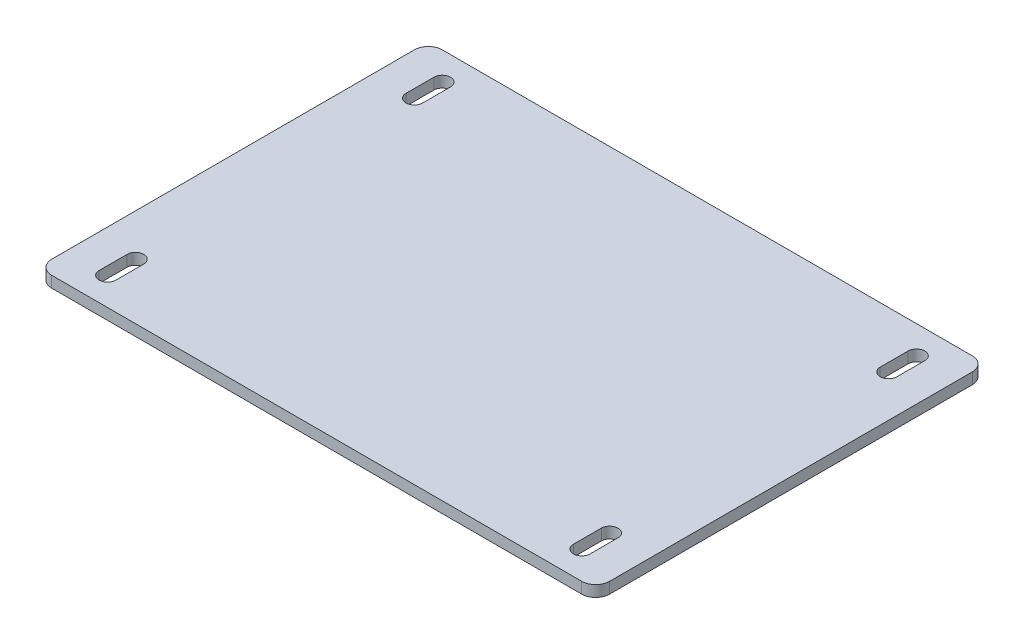
ISO-10303-21;
HEADER;
FILE_DESCRIPTION(('STEP AP214'),'2;1');
FILE_NAME('part.step','',(''),(''),'','','');
FILE_SCHEMA(('AUTOMOTIVE_DESIGN { 1 0 10303 214 1 1 1 1 }'));
ENDSEC;
DATA;
#1=APPLICATION_CONTEXT('core data for automotive mechanical design processes');
#2=APPLICATION_PROTOCOL_DEFINITION('international standard','automotive_design',2000,#1);
#3=PRODUCT_CONTEXT('',#1,'mechanical');
#4=PRODUCT('Part','Part','',(#3));
#5=PRODUCT_RELATED_PRODUCT_CATEGORY('part','',(#4));
#6=PRODUCT_DEFINITION_FORMATION('','',#4);
#7=PRODUCT_DEFINITION_CONTEXT('part definition',#1,'design');
#8=PRODUCT_DEFINITION('design','',#6,#7);
#9=PRODUCT_DEFINITION_SHAPE('','',#8);
#10=(LENGTH_UNIT() NAMED_UNIT(*) SI_UNIT(.MILLI.,.METRE.));
#11=(NAMED_UNIT(*) PLANE_ANGLE_UNIT() SI_UNIT($,.RADIAN.));
#12=(NAMED_UNIT(*) SI_UNIT($,.STERADIAN.) SOLID_ANGLE_UNIT());
#13=UNCERTAINTY_MEASURE_WITH_UNIT(LENGTH_MEASURE(1.E-05),#10,'distance_accuracy_value','');
#14=(GEOMETRIC_REPRESENTATION_CONTEXT(3) GLOBAL_UNCERTAINTY_ASSIGNED_CONTEXT((#13)) GLOBAL_UNIT_ASSIGNED_CONTEXT((#10,
#11,#12)) REPRESENTATION_CONTEXT('',''));
#15=CARTESIAN_POINT('',(0.,0.,0.));
#16=DIRECTION('',(0.,0.,1.));
#17=DIRECTION('',(1.,0.,0.));
#18=AXIS2_PLACEMENT_3D('',#15,#16,#17);
#19=CARTESIAN_POINT('',(100.,2.,70.));
#20=DIRECTION('',(-1.,0.,0.));
#21=DIRECTION('',(0.,0.,1.));
#22=AXIS2_PLACEMENT_3D('',#19,#20,#21);
#23=PLANE('',#22);
#24=DIRECTION('',(0.,0.,-1.));
#25=VECTOR('',#24,1.);
#26=CARTESIAN_POINT('',(100.,-2.,70.));
#27=LINE('',#26,#25);
#28=CARTESIAN_POINT('',(100.,-2.,65.));
#29=VERTEX_POINT('',#28);
#30=CARTESIAN_POINT('',(100.,-2.,-65.));
#31=VERTEX_POINT('',#30);
#32=EDGE_CURVE('E376',#29,#31,#27,.T.);
#33=ORIENTED_EDGE('',*,*,#32,.T.);
#34=DIRECTION('',(0.,-1.,0.));
#35=VECTOR('',#34,1.);
#36=CARTESIAN_POINT('',(100.,2.,-65.));
#37=LINE('',#36,#35);
#38=CARTESIAN_POINT('',(100.,2.,-65.));
#39=VERTEX_POINT('',#38);
#40=EDGE_CURVE('E437',#31,#39,#37,.F.);
#41=ORIENTED_EDGE('',*,*,#40,.T.);
#42=DIRECTION('',(0.,0.,-1.));
#43=VECTOR('',#42,1.);
#44=CARTESIAN_POINT('',(100.,2.,70.));
#45=LINE('',#44,#43);
#46=CARTESIAN_POINT('',(100.,2.,65.));
#47=VERTEX_POINT('',#46);
#48=EDGE_CURVE('E386',#47,#39,#45,.T.);
#49=ORIENTED_EDGE('',*,*,#48,.F.);
#50=DIRECTION('',(0.,-1.,0.));
#51=VECTOR('',#50,1.);
#52=CARTESIAN_POINT('',(100.,2.,65.));
#53=LINE('',#52,#51);
#54=EDGE_CURVE('E433',#47,#29,#53,.T.);
#55=ORIENTED_EDGE('',*,*,#54,.T.);
#56=EDGE_LOOP('',(#33,#41,#49,#55));
#57=FACE_BOUND('',#56,.T.);
#58=ADVANCED_FACE('F43',(#57),#23,.F.);
#59=CARTESIAN_POINT('',(-100.,2.,-70.));
#60=DIRECTION('',(0.,0.,1.));
#61=DIRECTION('',(1.,0.,0.));
#62=AXIS2_PLACEMENT_3D('',#59,#60,#61);
#63=PLANE('',#62);
#64=DIRECTION('',(-1.,0.,0.));
#65=VECTOR('',#64,1.);
#66=CARTESIAN_POINT('',(-100.,2.,-70.));
#67=LINE('',#66,#65);
#68=CARTESIAN_POINT('',(95.,2.,-70.));
#69=VERTEX_POINT('',#68);
#70=CARTESIAN_POINT('',(-95.,2.,-70.));
#71=VERTEX_POINT('',#70);
#72=EDGE_CURVE('E390',#69,#71,#67,.T.);
#73=ORIENTED_EDGE('',*,*,#72,.F.);
#74=DIRECTION('',(0.,-1.,0.));
#75=VECTOR('',#74,1.);
#76=CARTESIAN_POINT('',(95.,2.,-70.));
#77=LINE('',#76,#75);
#78=CARTESIAN_POINT('',(95.,-2.,-70.));
#79=VERTEX_POINT('',#78);
#80=EDGE_CURVE('E417',#69,#79,#77,.T.);
#81=ORIENTED_EDGE('',*,*,#80,.T.);
#82=DIRECTION('',(-1.,0.,0.));
#83=VECTOR('',#82,1.);
#84=CARTESIAN_POINT('',(-100.,-2.,-70.));
#85=LINE('',#84,#83);
#86=CARTESIAN_POINT('',(-95.,-2.,-70.));
#87=VERTEX_POINT('',#86);
#88=EDGE_CURVE('E405',#79,#87,#85,.T.);
#89=ORIENTED_EDGE('',*,*,#88,.T.);
#90=DIRECTION('',(0.,-1.,0.));
#91=VECTOR('',#90,1.);
#92=CARTESIAN_POINT('',(-95.,2.,-70.));
#93=LINE('',#92,#91);
#94=EDGE_CURVE('E401',#87,#71,#93,.F.);
#95=ORIENTED_EDGE('',*,*,#94,.T.);
#96=EDGE_LOOP('',(#73,#81,#89,#95));
#97=FACE_BOUND('',#96,.T.);
#98=ADVANCED_FACE('F487',(#97),#63,.F.);
#99=CARTESIAN_POINT('',(-100.,2.,70.));
#100=DIRECTION('',(1.,0.,0.));
#101=DIRECTION('',(0.,0.,-1.));
#102=AXIS2_PLACEMENT_3D('',#99,#100,#101);
#103=PLANE('',#102);
#104=DIRECTION('',(0.,0.,1.));
#105=VECTOR('',#104,1.);
#106=CARTESIAN_POINT('',(-100.,2.,70.));
#107=LINE('',#106,#105);
#108=CARTESIAN_POINT('',(-100.,2.,-65.));
#109=VERTEX_POINT('',#108);
#110=CARTESIAN_POINT('',(-100.,2.,65.));
#111=VERTEX_POINT('',#110);
#112=EDGE_CURVE('E395',#109,#111,#107,.T.);
#113=ORIENTED_EDGE('',*,*,#112,.F.);
#114=DIRECTION('',(0.,-1.,0.));
#115=VECTOR('',#114,1.);
#116=CARTESIAN_POINT('',(-100.,2.,-65.));
#117=LINE('',#116,#115);
#118=CARTESIAN_POINT('',(-100.,-2.,-65.));
#119=VERTEX_POINT('',#118);
#120=EDGE_CURVE('E454',#109,#119,#117,.T.);
#121=ORIENTED_EDGE('',*,*,#120,.T.);
#122=DIRECTION('',(0.,0.,1.));
#123=VECTOR('',#122,1.);
#124=CARTESIAN_POINT('',(-100.,-2.,70.));
#125=LINE('',#124,#123);
#126=CARTESIAN_POINT('',(-100.,-2.,65.));
#127=VERTEX_POINT('',#126);
#128=EDGE_CURVE('E409',#119,#127,#125,.T.);
#129=ORIENTED_EDGE('',*,*,#128,.T.);
#130=DIRECTION('',(0.,-1.,0.));
#131=VECTOR('',#130,1.);
#132=CARTESIAN_POINT('',(-100.,2.,65.));
#133=LINE('',#132,#131);
#134=EDGE_CURVE('E451',#127,#111,#133,.F.);
#135=ORIENTED_EDGE('',*,*,#134,.T.);
#136=EDGE_LOOP('',(#113,#121,#129,#135));
#137=FACE_BOUND('',#136,.T.);
#138=ADVANCED_FACE('F462',(#137),#103,.F.);
#139=CARTESIAN_POINT('',(-100.,2.,70.));
#140=DIRECTION('',(0.,0.,-1.));
#141=DIRECTION('',(-1.,0.,0.));
#142=AXIS2_PLACEMENT_3D('',#139,#140,#141);
#143=PLANE('',#142);
#144=DIRECTION('',(1.,0.,0.));
#145=VECTOR('',#144,1.);
#146=CARTESIAN_POINT('',(-100.,2.,70.));
#147=LINE('',#146,#145);
#148=CARTESIAN_POINT('',(-95.,2.,70.));
#149=VERTEX_POINT('',#148);
#150=CARTESIAN_POINT('',(95.,2.,70.));
#151=VERTEX_POINT('',#150);
#152=EDGE_CURVE('E398',#149,#151,#147,.T.);
#153=ORIENTED_EDGE('',*,*,#152,.F.);
#154=DIRECTION('',(0.,-1.,0.));
#155=VECTOR('',#154,1.);
#156=CARTESIAN_POINT('',(-95.,2.,70.));
#157=LINE('',#156,#155);
#158=CARTESIAN_POINT('',(-95.,-2.,70.));
#159=VERTEX_POINT('',#158);
#160=EDGE_CURVE('E11',#149,#159,#157,.T.);
#161=ORIENTED_EDGE('',*,*,#160,.T.);
#162=DIRECTION('',(1.,0.,0.));
#163=VECTOR('',#162,1.);
#164=CARTESIAN_POINT('',(-100.,-2.,70.));
#165=LINE('',#164,#163);
#166=CARTESIAN_POINT('',(95.,-2.,70.));
#167=VERTEX_POINT('',#166);
#168=EDGE_CURVE('E391',#159,#167,#165,.T.);
#169=ORIENTED_EDGE('',*,*,#168,.T.);
#170=DIRECTION('',(0.,-1.,0.));
#171=VECTOR('',#170,1.);
#172=CARTESIAN_POINT('',(95.,2.,70.));
#173=LINE('',#172,#171);
#174=EDGE_CURVE('E52',#167,#151,#173,.F.);
#175=ORIENTED_EDGE('',*,*,#174,.T.);
#176=EDGE_LOOP('',(#153,#161,#169,#175));
#177=FACE_BOUND('',#176,.T.);
#178=ADVANCED_FACE('F473',(#177),#143,.F.);
#179=CARTESIAN_POINT('',(0.,2.,0.));
#180=DIRECTION('',(0.,-1.,0.));
#181=DIRECTION('',(0.,0.,-1.));
#182=AXIS2_PLACEMENT_3D('',#179,#180,#181);
#183=PLANE('',#182);
#184=DIRECTION('',(0.,0.,-1.));
#185=VECTOR('',#184,1.);
#186=CARTESIAN_POINT('',(-82.,2.,60.));
#187=LINE('',#186,#185);
#188=CARTESIAN_POINT('',(-82.,2.,60.));
#189=VERTEX_POINT('',#188);
#190=CARTESIAN_POINT('',(-82.,2.,50.));
#191=VERTEX_POINT('',#190);
#192=EDGE_CURVE('E325',#189,#191,#187,.T.);
#193=ORIENTED_EDGE('',*,*,#192,.F.);
#194=CARTESIAN_POINT('',(-85.,2.,60.));
#195=DIRECTION('',(0.,1.,0.));
#196=DIRECTION('',(0.,0.,-1.));
#197=AXIS2_PLACEMENT_3D('',#194,#195,#196);
#198=CIRCLE('',#197,3.);
#199=CARTESIAN_POINT('',(-88.0000000000001,2.,60.));
#200=VERTEX_POINT('',#199);
#201=EDGE_CURVE('E272',#200,#189,#198,.T.);
#202=ORIENTED_EDGE('',*,*,#201,.F.);
#203=DIRECTION('',(0.,0.,1.));
#204=VECTOR('',#203,1.);
#205=CARTESIAN_POINT('',(-88.0000000000001,2.,60.));
#206=LINE('',#205,#204);
#207=CARTESIAN_POINT('',(-88.,2.,50.));
#208=VERTEX_POINT('',#207);
#209=EDGE_CURVE('E316',#208,#200,#206,.T.);
#210=ORIENTED_EDGE('',*,*,#209,.F.);
#211=CARTESIAN_POINT('',(-85.,2.,50.));
#212=DIRECTION('',(0.,1.,0.));
#213=DIRECTION('',(0.,0.,-1.));
#214=AXIS2_PLACEMENT_3D('',#211,#212,#213);
#215=CIRCLE('',#214,3.);
#216=EDGE_CURVE('E320',#191,#208,#215,.T.);
#217=ORIENTED_EDGE('',*,*,#216,.F.);
#218=EDGE_LOOP('',(#193,#202,#210,#217));
#219=FACE_BOUND('',#218,.T.);
#220=DIRECTION('',(0.,0.,-1.));
#221=VECTOR('',#220,1.);
#222=CARTESIAN_POINT('',(88.,2.,60.));
#223=LINE('',#222,#221);
#224=CARTESIAN_POINT('',(88.,2.,60.));
#225=VERTEX_POINT('',#224);
#226=CARTESIAN_POINT('',(88.,2.,50.));
#227=VERTEX_POINT('',#226);
#228=EDGE_CURVE('E282',#225,#227,#223,.T.);
#229=ORIENTED_EDGE('',*,*,#228,.F.);
#230=CARTESIAN_POINT('',(85.,2.,60.));
#231=DIRECTION('',(0.,1.,0.));
#232=DIRECTION('',(0.,0.,1.));
#233=AXIS2_PLACEMENT_3D('',#230,#231,#232);
#234=CIRCLE('',#233,3.);
#235=CARTESIAN_POINT('',(82.,2.,60.));
#236=VERTEX_POINT('',#235);
#237=EDGE_CURVE('E218',#236,#225,#234,.T.);
#238=ORIENTED_EDGE('',*,*,#237,.F.);
#239=DIRECTION('',(0.,0.,1.));
#240=VECTOR('',#239,1.);
#241=CARTESIAN_POINT('',(82.,2.,60.));
#242=LINE('',#241,#240);
#243=CARTESIAN_POINT('',(82.,2.,50.));
#244=VERTEX_POINT('',#243);
#245=EDGE_CURVE('E273',#244,#236,#242,.T.);
#246=ORIENTED_EDGE('',*,*,#245,.F.);
#247=CARTESIAN_POINT('',(85.,2.,50.));
#248=DIRECTION('',(0.,1.,0.));
#249=DIRECTION('',(0.,0.,1.));
#250=AXIS2_PLACEMENT_3D('',#247,#248,#249);
#251=CIRCLE('',#250,3.);
#252=EDGE_CURVE('E277',#227,#244,#251,.T.);
#253=ORIENTED_EDGE('',*,*,#252,.F.);
#254=EDGE_LOOP('',(#229,#238,#246,#253));
#255=FACE_BOUND('',#254,.T.);
#256=DIRECTION('',(0.,0.,1.));
#257=VECTOR('',#256,1.);
#258=CARTESIAN_POINT('',(82.,2.,-60.));
#259=LINE('',#258,#257);
#260=CARTESIAN_POINT('',(82.,2.,-60.));
#261=VERTEX_POINT('',#260);
#262=CARTESIAN_POINT('',(82.,2.,-50.));
#263=VERTEX_POINT('',#262);
#264=EDGE_CURVE('E233',#261,#263,#259,.T.);
#265=ORIENTED_EDGE('',*,*,#264,.F.);
#266=CARTESIAN_POINT('',(85.,2.,-60.0000000000001));
#267=DIRECTION('',(0.,1.,0.));
#268=DIRECTION('',(0.,0.,-1.));
#269=AXIS2_PLACEMENT_3D('',#266,#267,#268);
#270=CIRCLE('',#269,3.);
#271=CARTESIAN_POINT('',(88.,2.,-60.));
#272=VERTEX_POINT('',#271);
#273=EDGE_CURVE('E209',#272,#261,#270,.T.);
#274=ORIENTED_EDGE('',*,*,#273,.F.);
#275=DIRECTION('',(0.,0.,-1.));
#276=VECTOR('',#275,1.);
#277=CARTESIAN_POINT('',(88.,2.,-60.));
#278=LINE('',#277,#276);
#279=CARTESIAN_POINT('',(88.,2.,-50.));
#280=VERTEX_POINT('',#279);
#281=EDGE_CURVE('E221',#280,#272,#278,.T.);
#282=ORIENTED_EDGE('',*,*,#281,.F.);
#283=CARTESIAN_POINT('',(85.,2.,-50.));
#284=DIRECTION('',(0.,1.,0.));
#285=DIRECTION('',(0.,0.,-1.));
#286=AXIS2_PLACEMENT_3D('',#283,#284,#285);
#287=CIRCLE('',#286,3.);
#288=EDGE_CURVE('E227',#263,#280,#287,.T.);
#289=ORIENTED_EDGE('',*,*,#288,.F.);
#290=EDGE_LOOP('',(#265,#274,#282,#289));
#291=FACE_BOUND('',#290,.T.);
#292=DIRECTION('',(0.,0.,1.));
#293=VECTOR('',#292,1.);
#294=CARTESIAN_POINT('',(-88.0000000000001,2.,-60.));
#295=LINE('',#294,#293);
#296=CARTESIAN_POINT('',(-88.0000000000001,2.,-60.));
#297=VERTEX_POINT('',#296);
#298=CARTESIAN_POINT('',(-88.,2.,-50.));
#299=VERTEX_POINT('',#298);
#300=EDGE_CURVE('E239',#297,#299,#295,.T.);
#301=ORIENTED_EDGE('',*,*,#300,.F.);
#302=CARTESIAN_POINT('',(-85.,2.,-60.));
#303=DIRECTION('',(0.,1.,0.));
#304=DIRECTION('',(0.,0.,1.));
#305=AXIS2_PLACEMENT_3D('',#302,#303,#304);
#306=CIRCLE('',#305,3.);
#307=CARTESIAN_POINT('',(-82.,2.,-60.));
#308=VERTEX_POINT('',#307);
#309=EDGE_CURVE('E235',#308,#297,#306,.T.);
#310=ORIENTED_EDGE('',*,*,#309,.F.);
#311=DIRECTION('',(0.,0.,-1.));
#312=VECTOR('',#311,1.);
#313=CARTESIAN_POINT('',(-82.,2.,-60.));
#314=LINE('',#313,#312);
#315=CARTESIAN_POINT('',(-82.,2.,-50.));
#316=VERTEX_POINT('',#315);
#317=EDGE_CURVE('E350',#316,#308,#314,.T.);
#318=ORIENTED_EDGE('',*,*,#317,.F.);
#319=CARTESIAN_POINT('',(-85.,2.,-50.));
#320=DIRECTION('',(0.,1.,0.));
#321=DIRECTION('',(0.,0.,1.));
#322=AXIS2_PLACEMENT_3D('',#319,#320,#321);
#323=CIRCLE('',#322,3.);
#324=EDGE_CURVE('E366',#299,#316,#323,.T.);
#325=ORIENTED_EDGE('',*,*,#324,.F.);
#326=EDGE_LOOP('',(#301,#310,#318,#325));
#327=FACE_BOUND('',#326,.T.);
#328=ORIENTED_EDGE('',*,*,#48,.T.);
#329=CARTESIAN_POINT('',(95.,2.,-65.));
#330=DIRECTION('',(0.,-1.,0.));
#331=DIRECTION('',(0.,0.,-1.));
#332=AXIS2_PLACEMENT_3D('',#329,#330,#331);
#333=CIRCLE('',#332,5.);
#334=EDGE_CURVE('E448',#39,#69,#333,.F.);
#335=ORIENTED_EDGE('',*,*,#334,.T.);
#336=ORIENTED_EDGE('',*,*,#72,.T.);
#337=CARTESIAN_POINT('',(-95.,2.,-65.));
#338=DIRECTION('',(0.,-1.,0.));
#339=DIRECTION('',(0.,0.,-1.));
#340=AXIS2_PLACEMENT_3D('',#337,#338,#339);
#341=CIRCLE('',#340,5.);
#342=EDGE_CURVE('E445',#71,#109,#341,.F.);
#343=ORIENTED_EDGE('',*,*,#342,.T.);
#344=ORIENTED_EDGE('',*,*,#112,.T.);
#345=CARTESIAN_POINT('',(-95.,2.,65.));
#346=DIRECTION('',(0.,-1.,0.));
#347=DIRECTION('',(0.,0.,-1.));
#348=AXIS2_PLACEMENT_3D('',#345,#346,#347);
#349=CIRCLE('',#348,5.);
#350=EDGE_CURVE('E65',#111,#149,#349,.F.);
#351=ORIENTED_EDGE('',*,*,#350,.T.);
#352=ORIENTED_EDGE('',*,*,#152,.T.);
#353=CARTESIAN_POINT('',(95.,2.,65.));
#354=DIRECTION('',(0.,-1.,0.));
#355=DIRECTION('',(0.,0.,-1.));
#356=AXIS2_PLACEMENT_3D('',#353,#354,#355);
#357=CIRCLE('',#356,5.);
#358=EDGE_CURVE('E440',#151,#47,#357,.F.);
#359=ORIENTED_EDGE('',*,*,#358,.T.);
#360=EDGE_LOOP('',(#328,#335,#336,#343,#344,#351,#352,#359));
#361=FACE_BOUND('',#360,.T.);
#362=ADVANCED_FACE('F230',(#219,#255,#291,#327,#361),#183,.F.);
#363=CARTESIAN_POINT('',(0.,-2.,0.));
#364=DIRECTION('',(0.,-1.,0.));
#365=DIRECTION('',(0.,0.,-1.));
#366=AXIS2_PLACEMENT_3D('',#363,#364,#365);
#367=PLANE('',#366);
#368=CARTESIAN_POINT('',(-85.,-2.,60.));
#369=DIRECTION('',(0.,1.,0.));
#370=DIRECTION('',(0.,0.,-1.));
#371=AXIS2_PLACEMENT_3D('',#368,#369,#370);
#372=CIRCLE('',#371,3.);
#373=CARTESIAN_POINT('',(-88.0000000000001,-2.,60.));
#374=VERTEX_POINT('',#373);
#375=CARTESIAN_POINT('',(-82.,-2.,60.));
#376=VERTEX_POINT('',#375);
#377=EDGE_CURVE('E321',#374,#376,#372,.T.);
#378=ORIENTED_EDGE('',*,*,#377,.T.);
#379=DIRECTION('',(0.,0.,-1.));
#380=VECTOR('',#379,1.);
#381=CARTESIAN_POINT('',(-82.,-2.,60.));
#382=LINE('',#381,#380);
#383=CARTESIAN_POINT('',(-82.,-2.,50.));
#384=VERTEX_POINT('',#383);
#385=EDGE_CURVE('E338',#376,#384,#382,.T.);
#386=ORIENTED_EDGE('',*,*,#385,.T.);
#387=CARTESIAN_POINT('',(-85.,-2.,50.));
#388=DIRECTION('',(0.,1.,0.));
#389=DIRECTION('',(0.,0.,-1.));
#390=AXIS2_PLACEMENT_3D('',#387,#388,#389);
#391=CIRCLE('',#390,3.);
#392=CARTESIAN_POINT('',(-88.,-2.,50.));
#393=VERTEX_POINT('',#392);
#394=EDGE_CURVE('E334',#384,#393,#391,.T.);
#395=ORIENTED_EDGE('',*,*,#394,.T.);
#396=DIRECTION('',(0.,0.,1.));
#397=VECTOR('',#396,1.);
#398=CARTESIAN_POINT('',(-88.0000000000001,-2.,60.));
#399=LINE('',#398,#397);
#400=EDGE_CURVE('E306',#393,#374,#399,.T.);
#401=ORIENTED_EDGE('',*,*,#400,.T.);
#402=EDGE_LOOP('',(#378,#386,#395,#401));
#403=FACE_BOUND('',#402,.T.);
#404=CARTESIAN_POINT('',(85.,-2.,60.));
#405=DIRECTION('',(0.,1.,0.));
#406=DIRECTION('',(0.,0.,1.));
#407=AXIS2_PLACEMENT_3D('',#404,#405,#406);
#408=CIRCLE('',#407,3.);
#409=CARTESIAN_POINT('',(82.,-2.,60.));
#410=VERTEX_POINT('',#409);
#411=CARTESIAN_POINT('',(88.,-2.,60.));
#412=VERTEX_POINT('',#411);
#413=EDGE_CURVE('E278',#410,#412,#408,.T.);
#414=ORIENTED_EDGE('',*,*,#413,.T.);
#415=DIRECTION('',(0.,0.,-1.));
#416=VECTOR('',#415,1.);
#417=CARTESIAN_POINT('',(88.,-2.,60.));
#418=LINE('',#417,#416);
#419=CARTESIAN_POINT('',(88.,-2.,50.));
#420=VERTEX_POINT('',#419);
#421=EDGE_CURVE('E295',#412,#420,#418,.T.);
#422=ORIENTED_EDGE('',*,*,#421,.T.);
#423=CARTESIAN_POINT('',(85.,-2.,50.));
#424=DIRECTION('',(0.,1.,0.));
#425=DIRECTION('',(0.,0.,1.));
#426=AXIS2_PLACEMENT_3D('',#423,#424,#425);
#427=CIRCLE('',#426,3.);
#428=CARTESIAN_POINT('',(82.,-2.,50.));
#429=VERTEX_POINT('',#428);
#430=EDGE_CURVE('E291',#420,#429,#427,.T.);
#431=ORIENTED_EDGE('',*,*,#430,.T.);
#432=DIRECTION('',(0.,0.,1.));
#433=VECTOR('',#432,1.);
#434=CARTESIAN_POINT('',(82.,-2.,60.));
#435=LINE('',#434,#433);
#436=EDGE_CURVE('E262',#429,#410,#435,.T.);
#437=ORIENTED_EDGE('',*,*,#436,.T.);
#438=EDGE_LOOP('',(#414,#422,#431,#437));
#439=FACE_BOUND('',#438,.T.);
#440=CARTESIAN_POINT('',(85.,-2.,-60.0000000000001));
#441=DIRECTION('',(0.,1.,0.));
#442=DIRECTION('',(0.,0.,-1.));
#443=AXIS2_PLACEMENT_3D('',#440,#441,#442);
#444=CIRCLE('',#443,3.);
#445=CARTESIAN_POINT('',(88.,-2.,-60.));
#446=VERTEX_POINT('',#445);
#447=CARTESIAN_POINT('',(82.,-2.,-60.));
#448=VERTEX_POINT('',#447);
#449=EDGE_CURVE('E212',#446,#448,#444,.T.);
#450=ORIENTED_EDGE('',*,*,#449,.T.);
#451=DIRECTION('',(0.,0.,1.));
#452=VECTOR('',#451,1.);
#453=CARTESIAN_POINT('',(82.,-2.,-60.));
#454=LINE('',#453,#452);
#455=CARTESIAN_POINT('',(82.,-2.,-50.));
#456=VERTEX_POINT('',#455);
#457=EDGE_CURVE('E252',#448,#456,#454,.T.);
#458=ORIENTED_EDGE('',*,*,#457,.T.);
#459=CARTESIAN_POINT('',(85.,-2.,-50.));
#460=DIRECTION('',(0.,1.,0.));
#461=DIRECTION('',(0.,0.,-1.));
#462=AXIS2_PLACEMENT_3D('',#459,#460,#461);
#463=CIRCLE('',#462,3.);
#464=CARTESIAN_POINT('',(88.,-2.,-50.));
#465=VERTEX_POINT('',#464);
#466=EDGE_CURVE('E247',#456,#465,#463,.T.);
#467=ORIENTED_EDGE('',*,*,#466,.T.);
#468=DIRECTION('',(0.,0.,-1.));
#469=VECTOR('',#468,1.);
#470=CARTESIAN_POINT('',(88.,-2.,-60.));
#471=LINE('',#470,#469);
#472=EDGE_CURVE('E244',#465,#446,#471,.T.);
#473=ORIENTED_EDGE('',*,*,#472,.T.);
#474=EDGE_LOOP('',(#450,#458,#467,#473));
#475=FACE_BOUND('',#474,.T.);
#476=CARTESIAN_POINT('',(-85.,-2.,-60.));
#477=DIRECTION('',(0.,1.,0.));
#478=DIRECTION('',(0.,0.,1.));
#479=AXIS2_PLACEMENT_3D('',#476,#477,#478);
#480=CIRCLE('',#479,3.);
#481=CARTESIAN_POINT('',(-82.,-2.,-60.));
#482=VERTEX_POINT('',#481);
#483=CARTESIAN_POINT('',(-88.0000000000001,-2.,-60.));
#484=VERTEX_POINT('',#483);
#485=EDGE_CURVE('E345',#482,#484,#480,.T.);
#486=ORIENTED_EDGE('',*,*,#485,.T.);
#487=DIRECTION('',(0.,0.,1.));
#488=VECTOR('',#487,1.);
#489=CARTESIAN_POINT('',(-88.0000000000001,-2.,-60.));
#490=LINE('',#489,#488);
#491=CARTESIAN_POINT('',(-88.0000000000001,-2.,-50.));
#492=VERTEX_POINT('',#491);
#493=EDGE_CURVE('E349',#484,#492,#490,.T.);
#494=ORIENTED_EDGE('',*,*,#493,.T.);
#495=CARTESIAN_POINT('',(-85.,-2.,-50.));
#496=DIRECTION('',(0.,1.,0.));
#497=DIRECTION('',(0.,0.,1.));
#498=AXIS2_PLACEMENT_3D('',#495,#496,#497);
#499=CIRCLE('',#498,3.);
#500=CARTESIAN_POINT('',(-82.,-2.,-50.));
#501=VERTEX_POINT('',#500);
#502=EDGE_CURVE('E354',#492,#501,#499,.T.);
#503=ORIENTED_EDGE('',*,*,#502,.T.);
#504=DIRECTION('',(0.,0.,-1.));
#505=VECTOR('',#504,1.);
#506=CARTESIAN_POINT('',(-82.,-2.,-60.));
#507=LINE('',#506,#505);
#508=EDGE_CURVE('E358',#501,#482,#507,.T.);
#509=ORIENTED_EDGE('',*,*,#508,.T.);
#510=EDGE_LOOP('',(#486,#494,#503,#509));
#511=FACE_BOUND('',#510,.T.);
#512=ORIENTED_EDGE('',*,*,#88,.F.);
#513=CARTESIAN_POINT('',(95.,-2.,-65.));
#514=DIRECTION('',(0.,-1.,0.));
#515=DIRECTION('',(0.,0.,-1.));
#516=AXIS2_PLACEMENT_3D('',#513,#514,#515);
#517=CIRCLE('',#516,5.);
#518=EDGE_CURVE('E430',#79,#31,#517,.T.);
#519=ORIENTED_EDGE('',*,*,#518,.T.);
#520=ORIENTED_EDGE('',*,*,#32,.F.);
#521=CARTESIAN_POINT('',(95.,-2.,65.));
#522=DIRECTION('',(0.,-1.,0.));
#523=DIRECTION('',(0.,0.,-1.));
#524=AXIS2_PLACEMENT_3D('',#521,#522,#523);
#525=CIRCLE('',#524,5.);
#526=EDGE_CURVE('E421',#29,#167,#525,.T.);
#527=ORIENTED_EDGE('',*,*,#526,.T.);
#528=ORIENTED_EDGE('',*,*,#168,.F.);
#529=CARTESIAN_POINT('',(-95.,-2.,65.));
#530=DIRECTION('',(0.,-1.,0.));
#531=DIRECTION('',(0.,0.,-1.));
#532=AXIS2_PLACEMENT_3D('',#529,#530,#531);
#533=CIRCLE('',#532,5.);
#534=EDGE_CURVE('E424',#159,#127,#533,.T.);
#535=ORIENTED_EDGE('',*,*,#534,.T.);
#536=ORIENTED_EDGE('',*,*,#128,.F.);
#537=CARTESIAN_POINT('',(-95.,-2.,-65.));
#538=DIRECTION('',(0.,-1.,0.));
#539=DIRECTION('',(0.,0.,-1.));
#540=AXIS2_PLACEMENT_3D('',#537,#538,#539);
#541=CIRCLE('',#540,5.);
#542=EDGE_CURVE('E427',#119,#87,#541,.T.);
#543=ORIENTED_EDGE('',*,*,#542,.T.);
#544=EDGE_LOOP('',(#512,#519,#520,#527,#528,#535,#536,#543));
#545=FACE_BOUND('',#544,.T.);
#546=ADVANCED_FACE('F468',(#403,#439,#475,#511,#545),#367,.T.);
#547=CARTESIAN_POINT('',(-85.,-2.,-60.));
#548=DIRECTION('',(0.,1.,0.));
#549=DIRECTION('',(0.,0.,1.));
#550=AXIS2_PLACEMENT_3D('',#547,#548,#549);
#551=CYLINDRICAL_SURFACE('',#550,3.);
#552=ORIENTED_EDGE('',*,*,#309,.T.);
#553=DIRECTION('',(0.,1.,0.));
#554=VECTOR('',#553,1.);
#555=CARTESIAN_POINT('',(-88.0000000000001,-2.,-60.));
#556=LINE('',#555,#554);
#557=EDGE_CURVE('E361',#484,#297,#556,.T.);
#558=ORIENTED_EDGE('',*,*,#557,.F.);
#559=ORIENTED_EDGE('',*,*,#485,.F.);
#560=DIRECTION('',(0.,1.,0.));
#561=VECTOR('',#560,1.);
#562=CARTESIAN_POINT('',(-82.,-2.,-60.));
#563=LINE('',#562,#561);
#564=EDGE_CURVE('E373',#482,#308,#563,.T.);
#565=ORIENTED_EDGE('',*,*,#564,.T.);
#566=EDGE_LOOP('',(#552,#558,#559,#565));
#567=FACE_BOUND('',#566,.T.);
#568=ADVANCED_FACE('F511',(#567),#551,.F.);
#569=CARTESIAN_POINT('',(-82.,-2.,-60.));
#570=DIRECTION('',(1.,0.,0.));
#571=DIRECTION('',(0.,0.,-1.));
#572=AXIS2_PLACEMENT_3D('',#569,#570,#571);
#573=PLANE('',#572);
#574=ORIENTED_EDGE('',*,*,#317,.T.);
#575=ORIENTED_EDGE('',*,*,#564,.F.);
#576=ORIENTED_EDGE('',*,*,#508,.F.);
#577=DIRECTION('',(0.,1.,0.));
#578=VECTOR('',#577,1.);
#579=CARTESIAN_POINT('',(-82.,-2.,-50.));
#580=LINE('',#579,#578);
#581=EDGE_CURVE('E377',#501,#316,#580,.T.);
#582=ORIENTED_EDGE('',*,*,#581,.T.);
#583=EDGE_LOOP('',(#574,#575,#576,#582));
#584=FACE_BOUND('',#583,.T.);
#585=ADVANCED_FACE('F518',(#584),#573,.F.);
#586=CARTESIAN_POINT('',(-85.,-2.,-50.));
#587=DIRECTION('',(0.,1.,0.));
#588=DIRECTION('',(0.,0.,1.));
#589=AXIS2_PLACEMENT_3D('',#586,#587,#588);
#590=CYLINDRICAL_SURFACE('',#589,3.);
#591=ORIENTED_EDGE('',*,*,#324,.T.);
#592=ORIENTED_EDGE('',*,*,#581,.F.);
#593=ORIENTED_EDGE('',*,*,#502,.F.);
#594=DIRECTION('',(0.,1.,0.));
#595=VECTOR('',#594,1.);
#596=CARTESIAN_POINT('',(-88.,-2.,-50.));
#597=LINE('',#596,#595);
#598=EDGE_CURVE('E380',#492,#299,#597,.T.);
#599=ORIENTED_EDGE('',*,*,#598,.T.);
#600=EDGE_LOOP('',(#591,#592,#593,#599));
#601=FACE_BOUND('',#600,.T.);
#602=ADVANCED_FACE('F523',(#601),#590,.F.);
#603=CARTESIAN_POINT('',(-88.0000000000001,-2.,-60.));
#604=DIRECTION('',(-1.,0.,0.));
#605=DIRECTION('',(0.,0.,1.));
#606=AXIS2_PLACEMENT_3D('',#603,#604,#605);
#607=PLANE('',#606);
#608=ORIENTED_EDGE('',*,*,#300,.T.);
#609=ORIENTED_EDGE('',*,*,#598,.F.);
#610=ORIENTED_EDGE('',*,*,#493,.F.);
#611=ORIENTED_EDGE('',*,*,#557,.T.);
#612=EDGE_LOOP('',(#608,#609,#610,#611));
#613=FACE_BOUND('',#612,.T.);
#614=ADVANCED_FACE('F520',(#613),#607,.F.);
#615=CARTESIAN_POINT('',(85.,-2.,-60.0000000000001));
#616=DIRECTION('',(0.,1.,0.));
#617=DIRECTION('',(0.,0.,1.));
#618=AXIS2_PLACEMENT_3D('',#615,#616,#617);
#619=CYLINDRICAL_SURFACE('',#618,3.);
#620=ORIENTED_EDGE('',*,*,#273,.T.);
#621=DIRECTION('',(0.,1.,0.));
#622=VECTOR('',#621,1.);
#623=CARTESIAN_POINT('',(82.,-2.,-60.));
#624=LINE('',#623,#622);
#625=EDGE_CURVE('E248',#448,#261,#624,.T.);
#626=ORIENTED_EDGE('',*,*,#625,.F.);
#627=ORIENTED_EDGE('',*,*,#449,.F.);
#628=DIRECTION('',(0.,1.,0.));
#629=VECTOR('',#628,1.);
#630=CARTESIAN_POINT('',(88.,-2.,-60.));
#631=LINE('',#630,#629);
#632=EDGE_CURVE('E205',#446,#272,#631,.T.);
#633=ORIENTED_EDGE('',*,*,#632,.T.);
#634=EDGE_LOOP('',(#620,#626,#627,#633));
#635=FACE_BOUND('',#634,.T.);
#636=ADVANCED_FACE('F207',(#635),#619,.F.);
#637=CARTESIAN_POINT('',(88.,-2.,-60.));
#638=DIRECTION('',(1.,0.,0.));
#639=DIRECTION('',(0.,0.,-1.));
#640=AXIS2_PLACEMENT_3D('',#637,#638,#639);
#641=PLANE('',#640);
#642=ORIENTED_EDGE('',*,*,#281,.T.);
#643=ORIENTED_EDGE('',*,*,#632,.F.);
#644=ORIENTED_EDGE('',*,*,#472,.F.);
#645=DIRECTION('',(0.,1.,0.));
#646=VECTOR('',#645,1.);
#647=CARTESIAN_POINT('',(88.,-2.,-50.));
#648=LINE('',#647,#646);
#649=EDGE_CURVE('E217',#465,#280,#648,.T.);
#650=ORIENTED_EDGE('',*,*,#649,.T.);
#651=EDGE_LOOP('',(#642,#643,#644,#650));
#652=FACE_BOUND('',#651,.T.);
#653=ADVANCED_FACE('F222',(#652),#641,.F.);
#654=CARTESIAN_POINT('',(85.,-2.,-50.));
#655=DIRECTION('',(0.,1.,0.));
#656=DIRECTION('',(0.,0.,1.));
#657=AXIS2_PLACEMENT_3D('',#654,#655,#656);
#658=CYLINDRICAL_SURFACE('',#657,3.);
#659=ORIENTED_EDGE('',*,*,#288,.T.);
#660=ORIENTED_EDGE('',*,*,#649,.F.);
#661=ORIENTED_EDGE('',*,*,#466,.F.);
#662=DIRECTION('',(0.,1.,0.));
#663=VECTOR('',#662,1.);
#664=CARTESIAN_POINT('',(82.,-2.,-50.));
#665=LINE('',#664,#663);
#666=EDGE_CURVE('E780',#456,#263,#665,.T.);
#667=ORIENTED_EDGE('',*,*,#666,.T.);
#668=EDGE_LOOP('',(#659,#660,#661,#667));
#669=FACE_BOUND('',#668,.T.);
#670=ADVANCED_FACE('F565',(#669),#658,.F.);
#671=CARTESIAN_POINT('',(82.,-2.,-60.));
#672=DIRECTION('',(-1.,0.,0.));
#673=DIRECTION('',(0.,0.,1.));
#674=AXIS2_PLACEMENT_3D('',#671,#672,#673);
#675=PLANE('',#674);
#676=ORIENTED_EDGE('',*,*,#264,.T.);
#677=ORIENTED_EDGE('',*,*,#666,.F.);
#678=ORIENTED_EDGE('',*,*,#457,.F.);
#679=ORIENTED_EDGE('',*,*,#625,.T.);
#680=EDGE_LOOP('',(#676,#677,#678,#679));
#681=FACE_BOUND('',#680,.T.);
#682=ADVANCED_FACE('F561',(#681),#675,.F.);
#683=CARTESIAN_POINT('',(85.,-2.,60.));
#684=DIRECTION('',(0.,1.,0.));
#685=DIRECTION('',(0.,0.,1.));
#686=AXIS2_PLACEMENT_3D('',#683,#684,#685);
#687=CYLINDRICAL_SURFACE('',#686,3.);
#688=ORIENTED_EDGE('',*,*,#237,.T.);
#689=DIRECTION('',(0.,1.,0.));
#690=VECTOR('',#689,1.);
#691=CARTESIAN_POINT('',(88.,-2.,60.));
#692=LINE('',#691,#690);
#693=EDGE_CURVE('E258',#412,#225,#692,.T.);
#694=ORIENTED_EDGE('',*,*,#693,.F.);
#695=ORIENTED_EDGE('',*,*,#413,.F.);
#696=DIRECTION('',(0.,1.,0.));
#697=VECTOR('',#696,1.);
#698=CARTESIAN_POINT('',(82.,-2.,60.));
#699=LINE('',#698,#697);
#700=EDGE_CURVE('E269',#410,#236,#699,.T.);
#701=ORIENTED_EDGE('',*,*,#700,.T.);
#702=EDGE_LOOP('',(#688,#694,#695,#701));
#703=FACE_BOUND('',#702,.T.);
#704=ADVANCED_FACE('F551',(#703),#687,.F.);
#705=CARTESIAN_POINT('',(82.,-2.,60.));
#706=DIRECTION('',(-1.,0.,0.));
#707=DIRECTION('',(0.,0.,1.));
#708=AXIS2_PLACEMENT_3D('',#705,#706,#707);
#709=PLANE('',#708);
#710=ORIENTED_EDGE('',*,*,#245,.T.);
#711=ORIENTED_EDGE('',*,*,#700,.F.);
#712=ORIENTED_EDGE('',*,*,#436,.F.);
#713=DIRECTION('',(0.,1.,0.));
#714=VECTOR('',#713,1.);
#715=CARTESIAN_POINT('',(82.,-2.,50.));
#716=LINE('',#715,#714);
#717=EDGE_CURVE('E266',#429,#244,#716,.T.);
#718=ORIENTED_EDGE('',*,*,#717,.T.);
#719=EDGE_LOOP('',(#710,#711,#712,#718));
#720=FACE_BOUND('',#719,.T.);
#721=ADVANCED_FACE('F547',(#720),#709,.F.);
#722=CARTESIAN_POINT('',(85.,-2.,50.));
#723=DIRECTION('',(0.,1.,0.));
#724=DIRECTION('',(0.,0.,1.));
#725=AXIS2_PLACEMENT_3D('',#722,#723,#724);
#726=CYLINDRICAL_SURFACE('',#725,3.);
#727=ORIENTED_EDGE('',*,*,#252,.T.);
#728=ORIENTED_EDGE('',*,*,#717,.F.);
#729=ORIENTED_EDGE('',*,*,#430,.F.);
#730=DIRECTION('',(0.,1.,0.));
#731=VECTOR('',#730,1.);
#732=CARTESIAN_POINT('',(88.,-2.,50.));
#733=LINE('',#732,#731);
#734=EDGE_CURVE('E263',#420,#227,#733,.T.);
#735=ORIENTED_EDGE('',*,*,#734,.T.);
#736=EDGE_LOOP('',(#727,#728,#729,#735));
#737=FACE_BOUND('',#736,.T.);
#738=ADVANCED_FACE('F550',(#737),#726,.F.);
#739=CARTESIAN_POINT('',(88.,-2.,60.));
#740=DIRECTION('',(1.,0.,0.));
#741=DIRECTION('',(0.,0.,-1.));
#742=AXIS2_PLACEMENT_3D('',#739,#740,#741);
#743=PLANE('',#742);
#744=ORIENTED_EDGE('',*,*,#228,.T.);
#745=ORIENTED_EDGE('',*,*,#734,.F.);
#746=ORIENTED_EDGE('',*,*,#421,.F.);
#747=ORIENTED_EDGE('',*,*,#693,.T.);
#748=EDGE_LOOP('',(#744,#745,#746,#747));
#749=FACE_BOUND('',#748,.T.);
#750=ADVANCED_FACE('F545',(#749),#743,.F.);
#751=CARTESIAN_POINT('',(-85.,-2.,60.));
#752=DIRECTION('',(0.,1.,0.));
#753=DIRECTION('',(0.,0.,1.));
#754=AXIS2_PLACEMENT_3D('',#751,#752,#753);
#755=CYLINDRICAL_SURFACE('',#754,3.);
#756=ORIENTED_EDGE('',*,*,#201,.T.);
#757=DIRECTION('',(0.,1.,0.));
#758=VECTOR('',#757,1.);
#759=CARTESIAN_POINT('',(-82.,-2.,60.));
#760=LINE('',#759,#758);
#761=EDGE_CURVE('E302',#376,#189,#760,.T.);
#762=ORIENTED_EDGE('',*,*,#761,.F.);
#763=ORIENTED_EDGE('',*,*,#377,.F.);
#764=DIRECTION('',(0.,1.,0.));
#765=VECTOR('',#764,1.);
#766=CARTESIAN_POINT('',(-88.0000000000001,-2.,60.));
#767=LINE('',#766,#765);
#768=EDGE_CURVE('E313',#374,#200,#767,.T.);
#769=ORIENTED_EDGE('',*,*,#768,.T.);
#770=EDGE_LOOP('',(#756,#762,#763,#769));
#771=FACE_BOUND('',#770,.T.);
#772=ADVANCED_FACE('F535',(#771),#755,.F.);
#773=CARTESIAN_POINT('',(-88.0000000000001,-2.,60.));
#774=DIRECTION('',(-1.,0.,0.));
#775=DIRECTION('',(0.,0.,1.));
#776=AXIS2_PLACEMENT_3D('',#773,#774,#775);
#777=PLANE('',#776);
#778=ORIENTED_EDGE('',*,*,#209,.T.);
#779=ORIENTED_EDGE('',*,*,#768,.F.);
#780=ORIENTED_EDGE('',*,*,#400,.F.);
#781=DIRECTION('',(0.,1.,0.));
#782=VECTOR('',#781,1.);
#783=CARTESIAN_POINT('',(-88.,-2.,50.));
#784=LINE('',#783,#782);
#785=EDGE_CURVE('E310',#393,#208,#784,.T.);
#786=ORIENTED_EDGE('',*,*,#785,.T.);
#787=EDGE_LOOP('',(#778,#779,#780,#786));
#788=FACE_BOUND('',#787,.T.);
#789=ADVANCED_FACE('F531',(#788),#777,.F.);
#790=CARTESIAN_POINT('',(-85.,-2.,50.));
#791=DIRECTION('',(0.,1.,0.));
#792=DIRECTION('',(0.,0.,1.));
#793=AXIS2_PLACEMENT_3D('',#790,#791,#792);
#794=CYLINDRICAL_SURFACE('',#793,3.);
#795=ORIENTED_EDGE('',*,*,#216,.T.);
#796=ORIENTED_EDGE('',*,*,#785,.F.);
#797=ORIENTED_EDGE('',*,*,#394,.F.);
#798=DIRECTION('',(0.,1.,0.));
#799=VECTOR('',#798,1.);
#800=CARTESIAN_POINT('',(-82.,-2.,50.));
#801=LINE('',#800,#799);
#802=EDGE_CURVE('E307',#384,#191,#801,.T.);
#803=ORIENTED_EDGE('',*,*,#802,.T.);
#804=EDGE_LOOP('',(#795,#796,#797,#803));
#805=FACE_BOUND('',#804,.T.);
#806=ADVANCED_FACE('F534',(#805),#794,.F.);
#807=CARTESIAN_POINT('',(-82.,-2.,60.));
#808=DIRECTION('',(1.,0.,0.));
#809=DIRECTION('',(0.,0.,-1.));
#810=AXIS2_PLACEMENT_3D('',#807,#808,#809);
#811=PLANE('',#810);
#812=ORIENTED_EDGE('',*,*,#192,.T.);
#813=ORIENTED_EDGE('',*,*,#802,.F.);
#814=ORIENTED_EDGE('',*,*,#385,.F.);
#815=ORIENTED_EDGE('',*,*,#761,.T.);
#816=EDGE_LOOP('',(#812,#813,#814,#815));
#817=FACE_BOUND('',#816,.T.);
#818=ADVANCED_FACE('F496',(#817),#811,.F.);
#819=CARTESIAN_POINT('',(95.,2.,-65.));
#820=DIRECTION('',(0.,-1.,0.));
#821=DIRECTION('',(0.,0.,-1.));
#822=AXIS2_PLACEMENT_3D('',#819,#820,#821);
#823=CYLINDRICAL_SURFACE('',#822,5.);
#824=ORIENTED_EDGE('',*,*,#334,.F.);
#825=ORIENTED_EDGE('',*,*,#40,.F.);
#826=ORIENTED_EDGE('',*,*,#518,.F.);
#827=ORIENTED_EDGE('',*,*,#80,.F.);
#828=EDGE_LOOP('',(#824,#825,#826,#827));
#829=FACE_BOUND('',#828,.T.);
#830=ADVANCED_FACE('F484',(#829),#823,.T.);
#831=CARTESIAN_POINT('',(-95.,2.,-65.));
#832=DIRECTION('',(0.,-1.,0.));
#833=DIRECTION('',(0.,0.,-1.));
#834=AXIS2_PLACEMENT_3D('',#831,#832,#833);
#835=CYLINDRICAL_SURFACE('',#834,5.);
#836=ORIENTED_EDGE('',*,*,#342,.F.);
#837=ORIENTED_EDGE('',*,*,#94,.F.);
#838=ORIENTED_EDGE('',*,*,#542,.F.);
#839=ORIENTED_EDGE('',*,*,#120,.F.);
#840=EDGE_LOOP('',(#836,#837,#838,#839));
#841=FACE_BOUND('',#840,.T.);
#842=ADVANCED_FACE('F489',(#841),#835,.T.);
#843=CARTESIAN_POINT('',(-95.,2.,65.));
#844=DIRECTION('',(0.,-1.,0.));
#845=DIRECTION('',(0.,0.,-1.));
#846=AXIS2_PLACEMENT_3D('',#843,#844,#845);
#847=CYLINDRICAL_SURFACE('',#846,5.);
#848=ORIENTED_EDGE('',*,*,#350,.F.);
#849=ORIENTED_EDGE('',*,*,#134,.F.);
#850=ORIENTED_EDGE('',*,*,#534,.F.);
#851=ORIENTED_EDGE('',*,*,#160,.F.);
#852=EDGE_LOOP('',(#848,#849,#850,#851));
#853=FACE_BOUND('',#852,.T.);
#854=ADVANCED_FACE('F472',(#853),#847,.T.);
#855=CARTESIAN_POINT('',(95.,2.,65.));
#856=DIRECTION('',(0.,-1.,0.));
#857=DIRECTION('',(0.,0.,-1.));
#858=AXIS2_PLACEMENT_3D('',#855,#856,#857);
#859=CYLINDRICAL_SURFACE('',#858,5.);
#860=ORIENTED_EDGE('',*,*,#358,.F.);
#861=ORIENTED_EDGE('',*,*,#174,.F.);
#862=ORIENTED_EDGE('',*,*,#526,.F.);
#863=ORIENTED_EDGE('',*,*,#54,.F.);
#864=EDGE_LOOP('',(#860,#861,#862,#863));
#865=FACE_BOUND('',#864,.T.);
#866=ADVANCED_FACE('F45',(#865),#859,.T.);
#867=CLOSED_SHELL('',(#58,#98,#138,#178,#362,#546,#568,#585,#602,#614,#636,#653,#670,#682,#704,
#721,#738,#750,#772,#789,#806,#818,#830,#842,#854,#866));
#868=MANIFOLD_SOLID_BREP('B2',#867);
#869=ADVANCED_BREP_SHAPE_REPRESENTATION('',(#18,#868),#14);
#870=SHAPE_DEFINITION_REPRESENTATION(#9,#869);
ENDSEC;
END-ISO-10303-21;
